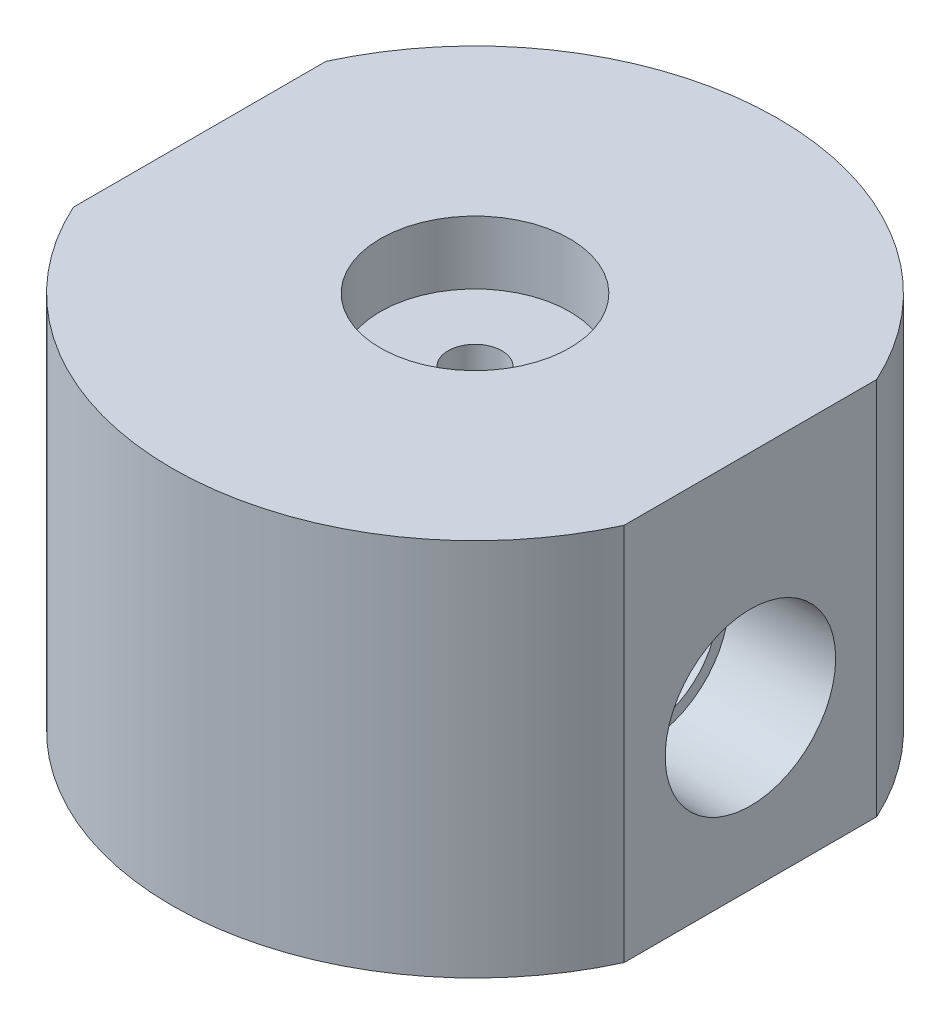
ISO-10303-21;
HEADER;
FILE_DESCRIPTION(('STEP AP214'),'2;1');
FILE_NAME('part.step','',(''),(''),'','','');
FILE_SCHEMA(('AUTOMOTIVE_DESIGN { 1 0 10303 214 1 1 1 1 }'));
ENDSEC;
DATA;
#1=APPLICATION_CONTEXT('core data for automotive mechanical design processes');
#2=APPLICATION_PROTOCOL_DEFINITION('international standard','automotive_design',2000,#1);
#3=PRODUCT_CONTEXT('',#1,'mechanical');
#4=PRODUCT('Part','Part','',(#3));
#5=PRODUCT_RELATED_PRODUCT_CATEGORY('part','',(#4));
#6=PRODUCT_DEFINITION_FORMATION('','',#4);
#7=PRODUCT_DEFINITION_CONTEXT('part definition',#1,'design');
#8=PRODUCT_DEFINITION('design','',#6,#7);
#9=PRODUCT_DEFINITION_SHAPE('','',#8);
#10=(LENGTH_UNIT() NAMED_UNIT(*) SI_UNIT(.MILLI.,.METRE.));
#11=(NAMED_UNIT(*) PLANE_ANGLE_UNIT() SI_UNIT($,.RADIAN.));
#12=(NAMED_UNIT(*) SI_UNIT($,.STERADIAN.) SOLID_ANGLE_UNIT());
#13=UNCERTAINTY_MEASURE_WITH_UNIT(LENGTH_MEASURE(1.E-05),#10,'distance_accuracy_value','');
#14=(GEOMETRIC_REPRESENTATION_CONTEXT(3) GLOBAL_UNCERTAINTY_ASSIGNED_CONTEXT((#13)) GLOBAL_UNIT_ASSIGNED_CONTEXT((#10,
#11,#12)) REPRESENTATION_CONTEXT('',''));
#15=CARTESIAN_POINT('',(0.,0.,0.));
#16=DIRECTION('',(0.,0.,1.));
#17=DIRECTION('',(1.,0.,0.));
#18=AXIS2_PLACEMENT_3D('',#15,#16,#17);
#19=CARTESIAN_POINT('',(0.,38.1,0.));
#20=DIRECTION('',(0.,1.,0.));
#21=DIRECTION('',(0.,0.,1.));
#22=AXIS2_PLACEMENT_3D('',#19,#20,#21);
#23=CYLINDRICAL_SURFACE('',#22,2.70509999999999);
#24=CARTESIAN_POINT('',(0.,20.6375,0.));
#25=DIRECTION('',(0.,1.,0.));
#26=DIRECTION('',(-1.,0.,0.));
#27=AXIS2_PLACEMENT_3D('',#24,#25,#26);
#28=CIRCLE('',#27,2.70509999999999);
#29=CARTESIAN_POINT('',(-2.70509999999999,20.6375,0.));
#30=VERTEX_POINT('',#29);
#31=EDGE_CURVE('E85',#30,#30,#28,.T.);
#32=ORIENTED_EDGE('',*,*,#31,.F.);
#33=EDGE_LOOP('',(#32));
#34=FACE_BOUND('',#33,.T.);
#35=CARTESIAN_POINT('',(0.,31.75,0.));
#36=DIRECTION('',(0.,1.,0.));
#37=DIRECTION('',(-1.,0.,0.));
#38=AXIS2_PLACEMENT_3D('',#35,#36,#37);
#39=CIRCLE('',#38,2.70509999999999);
#40=CARTESIAN_POINT('',(-2.70509999999999,31.75,0.));
#41=VERTEX_POINT('',#40);
#42=EDGE_CURVE('E40',#41,#41,#39,.F.);
#43=ORIENTED_EDGE('',*,*,#42,.F.);
#44=EDGE_LOOP('',(#43));
#45=FACE_BOUND('',#44,.T.);
#46=ADVANCED_FACE('F36',(#34,#45),#23,.F.);
#47=CARTESIAN_POINT('',(-30.48,0.,0.));
#48=DIRECTION('',(0.,1.,0.));
#49=DIRECTION('',(-1.,0.,0.));
#50=AXIS2_PLACEMENT_3D('',#47,#48,#49);
#51=PLANE('',#50);
#52=CARTESIAN_POINT('',(0.,0.,0.));
#53=DIRECTION('',(0.,-1.,0.));
#54=DIRECTION('',(1.,0.,0.));
#55=AXIS2_PLACEMENT_3D('',#52,#53,#54);
#56=CIRCLE('',#55,12.7);
#57=CARTESIAN_POINT('',(12.7,0.,0.));
#58=VERTEX_POINT('',#57);
#59=EDGE_CURVE('E99',#58,#58,#56,.T.);
#60=ORIENTED_EDGE('',*,*,#59,.F.);
#61=EDGE_LOOP('',(#60));
#62=FACE_BOUND('',#61,.T.);
#63=DIRECTION('',(0.,0.,-1.));
#64=VECTOR('',#63,1.);
#65=CARTESIAN_POINT('',(-27.7081287711747,0.,-12.7));
#66=LINE('',#65,#64);
#67=CARTESIAN_POINT('',(-27.7081287711747,0.,12.7));
#68=VERTEX_POINT('',#67);
#69=CARTESIAN_POINT('',(-27.7081287711747,0.,-12.7));
#70=VERTEX_POINT('',#69);
#71=EDGE_CURVE('E79',#68,#70,#66,.T.);
#72=ORIENTED_EDGE('',*,*,#71,.T.);
#73=CARTESIAN_POINT('',(0.,0.,0.));
#74=DIRECTION('',(0.,-1.,0.));
#75=DIRECTION('',(1.,0.,0.));
#76=AXIS2_PLACEMENT_3D('',#73,#74,#75);
#77=CIRCLE('',#76,30.48);
#78=CARTESIAN_POINT('',(27.7081287711747,0.,-12.7));
#79=VERTEX_POINT('',#78);
#80=EDGE_CURVE('E92',#70,#79,#77,.T.);
#81=ORIENTED_EDGE('',*,*,#80,.T.);
#82=DIRECTION('',(0.,0.,1.));
#83=VECTOR('',#82,1.);
#84=CARTESIAN_POINT('',(27.7081287711747,0.,-12.7));
#85=LINE('',#84,#83);
#86=CARTESIAN_POINT('',(27.7081287711747,0.,12.7));
#87=VERTEX_POINT('',#86);
#88=EDGE_CURVE('E121',#79,#87,#85,.T.);
#89=ORIENTED_EDGE('',*,*,#88,.T.);
#90=EDGE_CURVE('E94',#87,#68,#77,.T.);
#91=ORIENTED_EDGE('',*,*,#90,.T.);
#92=EDGE_LOOP('',(#72,#81,#89,#91));
#93=FACE_BOUND('',#92,.T.);
#94=ADVANCED_FACE('F90',(#62,#93),#51,.F.);
#95=CARTESIAN_POINT('',(0.,0.,0.));
#96=DIRECTION('',(0.,-1.,0.));
#97=DIRECTION('',(1.,0.,0.));
#98=AXIS2_PLACEMENT_3D('',#95,#96,#97);
#99=CYLINDRICAL_SURFACE('',#98,30.48);
#100=DIRECTION('',(0.,-1.,0.));
#101=VECTOR('',#100,1.);
#102=CARTESIAN_POINT('',(-27.7081287711747,38.1,-12.7));
#103=LINE('',#102,#101);
#104=CARTESIAN_POINT('',(-27.7081287711747,38.1,-12.7));
#105=VERTEX_POINT('',#104);
#106=EDGE_CURVE('E76',#105,#70,#103,.T.);
#107=ORIENTED_EDGE('',*,*,#106,.F.);
#108=CARTESIAN_POINT('',(0.,38.1,0.));
#109=DIRECTION('',(0.,-1.,0.));
#110=DIRECTION('',(1.,0.,0.));
#111=AXIS2_PLACEMENT_3D('',#108,#109,#110);
#112=CIRCLE('',#111,30.48);
#113=CARTESIAN_POINT('',(27.7081287711747,38.1,-12.7));
#114=VERTEX_POINT('',#113);
#115=EDGE_CURVE('E101',#105,#114,#112,.T.);
#116=ORIENTED_EDGE('',*,*,#115,.T.);
#117=DIRECTION('',(0.,-1.,0.));
#118=VECTOR('',#117,1.);
#119=CARTESIAN_POINT('',(27.7081287711747,38.1,-12.7));
#120=LINE('',#119,#118);
#121=EDGE_CURVE('E52',#114,#79,#120,.T.);
#122=ORIENTED_EDGE('',*,*,#121,.T.);
#123=ORIENTED_EDGE('',*,*,#80,.F.);
#124=EDGE_LOOP('',(#107,#116,#122,#123));
#125=FACE_BOUND('',#124,.T.);
#126=ADVANCED_FACE('F96',(#125),#99,.T.);
#127=DIRECTION('',(0.,-1.,0.));
#128=VECTOR('',#127,1.);
#129=CARTESIAN_POINT('',(-27.7081287711747,38.1,12.7));
#130=LINE('',#129,#128);
#131=CARTESIAN_POINT('',(-27.7081287711747,38.1,12.7));
#132=VERTEX_POINT('',#131);
#133=EDGE_CURVE('E60',#132,#68,#130,.T.);
#134=ORIENTED_EDGE('',*,*,#133,.T.);
#135=ORIENTED_EDGE('',*,*,#90,.F.);
#136=DIRECTION('',(0.,-1.,0.));
#137=VECTOR('',#136,1.);
#138=CARTESIAN_POINT('',(27.7081287711747,38.1,12.7));
#139=LINE('',#138,#137);
#140=CARTESIAN_POINT('',(27.7081287711747,38.1,12.7));
#141=VERTEX_POINT('',#140);
#142=EDGE_CURVE('E203',#141,#87,#139,.T.);
#143=ORIENTED_EDGE('',*,*,#142,.F.);
#144=EDGE_CURVE('E97',#141,#132,#112,.T.);
#145=ORIENTED_EDGE('',*,*,#144,.T.);
#146=EDGE_LOOP('',(#134,#135,#143,#145));
#147=FACE_BOUND('',#146,.T.);
#148=ADVANCED_FACE('F155',(#147),#99,.T.);
#149=CARTESIAN_POINT('',(0.,38.1,0.));
#150=DIRECTION('',(0.,-1.,0.));
#151=DIRECTION('',(1.,0.,0.));
#152=AXIS2_PLACEMENT_3D('',#149,#150,#151);
#153=PLANE('',#152);
#154=CARTESIAN_POINT('',(0.,38.1,0.));
#155=DIRECTION('',(0.,1.,0.));
#156=DIRECTION('',(-1.,0.,0.));
#157=AXIS2_PLACEMENT_3D('',#154,#155,#156);
#158=CIRCLE('',#157,9.525);
#159=CARTESIAN_POINT('',(-9.525,38.1,0.));
#160=VERTEX_POINT('',#159);
#161=EDGE_CURVE('E378',#160,#160,#158,.T.);
#162=ORIENTED_EDGE('',*,*,#161,.F.);
#163=EDGE_LOOP('',(#162));
#164=FACE_BOUND('',#163,.T.);
#165=DIRECTION('',(0.,0.,-1.));
#166=VECTOR('',#165,1.);
#167=CARTESIAN_POINT('',(-27.7081287711747,38.1,-12.7));
#168=LINE('',#167,#166);
#169=EDGE_CURVE('E80',#132,#105,#168,.T.);
#170=ORIENTED_EDGE('',*,*,#169,.F.);
#171=ORIENTED_EDGE('',*,*,#144,.F.);
#172=DIRECTION('',(0.,0.,1.));
#173=VECTOR('',#172,1.);
#174=CARTESIAN_POINT('',(27.7081287711747,38.1,-12.7));
#175=LINE('',#174,#173);
#176=EDGE_CURVE('E201',#114,#141,#175,.T.);
#177=ORIENTED_EDGE('',*,*,#176,.F.);
#178=ORIENTED_EDGE('',*,*,#115,.F.);
#179=EDGE_LOOP('',(#170,#171,#177,#178));
#180=FACE_BOUND('',#179,.T.);
#181=ADVANCED_FACE('F151',(#164,#180),#153,.F.);
#182=CARTESIAN_POINT('',(-4.7625,20.6375,0.));
#183=DIRECTION('',(0.,1.,0.));
#184=DIRECTION('',(-1.,0.,0.));
#185=AXIS2_PLACEMENT_3D('',#182,#183,#184);
#186=PLANE('',#185);
#187=ORIENTED_EDGE('',*,*,#31,.T.);
#188=EDGE_LOOP('',(#187));
#189=FACE_BOUND('',#188,.T.);
#190=CARTESIAN_POINT('',(0.,20.6375,0.));
#191=DIRECTION('',(0.,-1.,0.));
#192=DIRECTION('',(1.,0.,0.));
#193=AXIS2_PLACEMENT_3D('',#190,#191,#192);
#194=CIRCLE('',#193,4.7625);
#195=CARTESIAN_POINT('',(4.7625,20.6375,0.));
#196=VERTEX_POINT('',#195);
#197=EDGE_CURVE('E110',#196,#196,#194,.T.);
#198=ORIENTED_EDGE('',*,*,#197,.T.);
#199=EDGE_LOOP('',(#198));
#200=FACE_BOUND('',#199,.T.);
#201=ADVANCED_FACE('F154',(#189,#200),#186,.F.);
#202=CARTESIAN_POINT('',(0.,20.6375,0.));
#203=DIRECTION('',(0.,-1.,0.));
#204=DIRECTION('',(1.,0.,0.));
#205=AXIS2_PLACEMENT_3D('',#202,#203,#204);
#206=TOROIDAL_SURFACE('',#205,9.525,4.7625);
#207=ORIENTED_EDGE('',*,*,#197,.F.);
#208=EDGE_LOOP('',(#207));
#209=FACE_BOUND('',#208,.T.);
#210=CARTESIAN_POINT('',(0.,25.4,0.));
#211=DIRECTION('',(0.,-1.,0.));
#212=DIRECTION('',(1.,0.,0.));
#213=AXIS2_PLACEMENT_3D('',#210,#211,#212);
#214=CIRCLE('',#213,9.525);
#215=CARTESIAN_POINT('',(9.525,25.4,0.));
#216=VERTEX_POINT('',#215);
#217=EDGE_CURVE('E107',#216,#216,#214,.T.);
#218=ORIENTED_EDGE('',*,*,#217,.T.);
#219=EDGE_LOOP('',(#218));
#220=FACE_BOUND('',#219,.T.);
#221=ADVANCED_FACE('F170',(#209,#220),#206,.F.);
#222=CARTESIAN_POINT('',(-12.7,25.4,0.));
#223=DIRECTION('',(0.,1.,0.));
#224=DIRECTION('',(-1.,0.,0.));
#225=AXIS2_PLACEMENT_3D('',#222,#223,#224);
#226=PLANE('',#225);
#227=CARTESIAN_POINT('',(0.,25.4,0.));
#228=DIRECTION('',(0.,1.,0.));
#229=DIRECTION('',(-1.,0.,0.));
#230=AXIS2_PLACEMENT_3D('',#227,#228,#229);
#231=CIRCLE('',#230,11.1125);
#232=CARTESIAN_POINT('',(-11.1125,25.4,0.));
#233=VERTEX_POINT('',#232);
#234=EDGE_CURVE('E45',#233,#233,#231,.F.);
#235=ORIENTED_EDGE('',*,*,#234,.T.);
#236=EDGE_LOOP('',(#235));
#237=FACE_BOUND('',#236,.T.);
#238=ORIENTED_EDGE('',*,*,#217,.F.);
#239=EDGE_LOOP('',(#238));
#240=FACE_BOUND('',#239,.T.);
#241=ADVANCED_FACE('F165',(#237,#240),#226,.F.);
#242=CARTESIAN_POINT('',(0.,0.,0.));
#243=DIRECTION('',(0.,-1.,0.));
#244=DIRECTION('',(1.,0.,0.));
#245=AXIS2_PLACEMENT_3D('',#242,#243,#244);
#246=CYLINDRICAL_SURFACE('',#245,12.7);
#247=CARTESIAN_POINT('',(0.,23.8125,0.));
#248=DIRECTION('',(0.,1.,0.));
#249=DIRECTION('',(-1.,0.,0.));
#250=AXIS2_PLACEMENT_3D('',#247,#248,#249);
#251=CIRCLE('',#250,12.7);
#252=CARTESIAN_POINT('',(-12.7,23.8125,0.));
#253=VERTEX_POINT('',#252);
#254=EDGE_CURVE('E11',#253,#253,#251,.T.);
#255=ORIENTED_EDGE('',*,*,#254,.T.);
#256=EDGE_LOOP('',(#255));
#257=FACE_BOUND('',#256,.T.);
#258=CARTESIAN_POINT('',(-10.5046428420961,15.875,7.1374));
#259=CARTESIAN_POINT('',(-10.5046384380999,16.0571885207218,7.13740318034243));
#260=CARTESIAN_POINT('',(-10.5093972937738,16.239345236265,7.13041663459684));
#261=CARTESIAN_POINT('',(-10.5282237924394,16.6021747896126,7.1025907449902));
#262=CARTESIAN_POINT('',(-10.5422941351203,16.7828471816806,7.08174738360001));
#263=CARTESIAN_POINT('',(-10.5791968979329,17.1413879903336,7.02649901775071));
#264=CARTESIAN_POINT('',(-10.6020390798196,17.3192530523683,6.992078903218));
#265=CARTESIAN_POINT('',(-10.655618633279,17.6707973307695,6.91015072245628));
#266=CARTESIAN_POINT('',(-10.6863595676358,17.8444746194437,6.86263674945325));
#267=CARTESIAN_POINT('',(-10.7544138063225,18.1853243381491,6.75548490621666));
#268=CARTESIAN_POINT('',(-10.7916796970738,18.3525337341939,6.69593405006417));
#269=CARTESIAN_POINT('',(-10.8717790317736,18.6809650254671,6.56508234790449));
#270=CARTESIAN_POINT('',(-10.9146145325229,18.8421846803247,6.4937771585225));
#271=CARTESIAN_POINT('',(-11.0046465840686,19.157929153595,6.34000607577323));
#272=CARTESIAN_POINT('',(-11.0518427907881,19.3124544988045,6.25754106272219));
#273=CARTESIAN_POINT('',(-11.1494005157995,19.6142522248498,6.08202115176529));
#274=CARTESIAN_POINT('',(-11.1997621424831,19.7615243570098,5.98896589113528));
#275=CARTESIAN_POINT('',(-11.3647828713443,20.2222467242849,5.67375486549948));
#276=CARTESIAN_POINT('',(-11.4834901888025,20.5210942736974,5.43165852463271));
#277=CARTESIAN_POINT('',(-11.6601585300767,20.9373659806184,5.03505781718803));
#278=CARTESIAN_POINT('',(-11.7188534882378,21.0708661307312,4.89718124346336));
#279=CARTESIAN_POINT('',(-11.8345184709773,21.3267272916708,4.61064023873438));
#280=CARTESIAN_POINT('',(-11.8914881996462,21.4490863987388,4.46197397177976));
#281=CARTESIAN_POINT('',(-12.0074276448785,21.6924974144983,4.14047014968672));
#282=CARTESIAN_POINT('',(-12.0661057013464,21.8124117821013,3.96666477196833));
#283=CARTESIAN_POINT('',(-12.1781790237355,22.0369789824457,3.60794136867089));
#284=CARTESIAN_POINT('',(-12.2315766055884,22.1416385153443,3.42302827247314));
#285=CARTESIAN_POINT('',(-12.3315692759593,22.3346355130106,3.04318115996294));
#286=CARTESIAN_POINT('',(-12.3781667356681,22.4229786701377,2.84825066891206));
#287=CARTESIAN_POINT('',(-12.4631664513921,22.5822749882884,2.44968907177722));
#288=CARTESIAN_POINT('',(-12.5015698557444,22.6532305862587,2.24605918965644));
#289=CARTESIAN_POINT('',(-12.566054794428,22.7714080311198,1.84961155335952));
#290=CARTESIAN_POINT('',(-12.5929124085411,22.8201470613767,1.65737182841722));
#291=CARTESIAN_POINT('',(-12.6380040169668,22.9015764797823,1.26852227946975));
#292=CARTESIAN_POINT('',(-12.6562384639096,22.9342677102836,1.07191268540637));
#293=CARTESIAN_POINT('',(-12.6835382069931,22.9830960790112,0.676148620600247));
#294=CARTESIAN_POINT('',(-12.6926096410685,22.9992442988397,0.47699594403947));
#295=CARTESIAN_POINT('',(-12.7013297715325,23.0147689488544,0.0778383656640306));
#296=CARTESIAN_POINT('',(-12.7009792608145,23.0141467903334,-0.122166463022408));
#297=CARTESIAN_POINT('',(-12.6914261859183,22.9971354781539,-0.499298139911756));
#298=CARTESIAN_POINT('',(-12.6831974604438,22.9824808690008,-0.67653123111751));
#299=CARTESIAN_POINT('',(-12.6594778364211,22.940066758124,-1.02899179656521));
#300=CARTESIAN_POINT('',(-12.6439845353348,22.9123029208995,-1.20421858762946));
#301=CARTESIAN_POINT('',(-12.6061030371758,22.844011278604,-1.55133536569325));
#302=CARTESIAN_POINT('',(-12.5837172507358,22.803487936032,-1.72322649702429));
#303=CARTESIAN_POINT('',(-12.532545745632,22.7101083215367,-2.06271237029165));
#304=CARTESIAN_POINT('',(-12.5037575293403,22.6572472361837,-2.23030540697949));
#305=CARTESIAN_POINT('',(-12.4401106775075,22.5391826403443,-2.56171308094082));
#306=CARTESIAN_POINT('',(-12.4051980211314,22.4738688026832,-2.72547801440405));
#307=CARTESIAN_POINT('',(-12.3302228224087,22.3318180554349,-3.04677940544123));
#308=CARTESIAN_POINT('',(-12.290158554304,22.2550773165393,-3.20431375257775));
#309=CARTESIAN_POINT('',(-12.1634430119379,22.0086596040008,-3.66639570123493));
#310=CARTESIAN_POINT('',(-12.0702275186606,21.8227122647099,-3.96063011120466));
#311=CARTESIAN_POINT('',(-11.8623879915353,21.3894169315703,-4.5476597164089));
#312=CARTESIAN_POINT('',(-11.7465362459822,21.137548056501,-4.83668159530947));
#313=CARTESIAN_POINT('',(-11.5709229239903,20.7282351982539,-5.23689917474902));
#314=CARTESIAN_POINT('',(-11.5120270642702,20.5864085953654,-5.3648494441244));
#315=CARTESIAN_POINT('',(-11.3949792904751,20.2927126755584,-5.60916804512605));
#316=CARTESIAN_POINT('',(-11.3368275126708,20.1408415496421,-5.72553428098645));
#317=CARTESIAN_POINT('',(-11.217344140053,19.8128627176192,-5.95648099288631));
#318=CARTESIAN_POINT('',(-11.1562320192129,19.6358212782517,-6.06985153604781));
#319=CARTESIAN_POINT('',(-11.0386951868657,19.2713226169917,-6.28106771389895));
#320=CARTESIAN_POINT('',(-10.982268388456,19.0838700950964,-6.3789202783591));
#321=CARTESIAN_POINT('',(-10.8761885637896,18.6995414941414,-6.55815279325877));
#322=CARTESIAN_POINT('',(-10.8265311583643,18.5026716196748,-6.63954340969375));
#323=CARTESIAN_POINT('',(-10.7360436879727,18.1006312817048,-6.78488827268485));
#324=CARTESIAN_POINT('',(-10.6952121648466,17.8954621960071,-6.84884539995476));
#325=CARTESIAN_POINT('',(-10.6271543479783,17.4950732288003,-6.9539337623092));
#326=CARTESIAN_POINT('',(-10.5991024742221,17.3003656025546,-6.99647904311352));
#327=CARTESIAN_POINT('',(-10.5533939050683,16.9068723001115,-7.06523838157507));
#328=CARTESIAN_POINT('',(-10.5357365202536,16.7080868952788,-7.09145352233967));
#329=CARTESIAN_POINT('',(-10.5116969767819,16.3085511391283,-7.12703947721939));
#330=CARTESIAN_POINT('',(-10.5053023850648,16.1078032008343,-7.13642886557634));
#331=CARTESIAN_POINT('',(-10.504080815511,15.7062081788998,-7.13822761317463));
#332=CARTESIAN_POINT('',(-10.5092524244061,15.5053611103699,-7.13063904694356));
#333=CARTESIAN_POINT('',(-10.5292025973892,15.1367353282911,-7.10113623496951));
#334=CARTESIAN_POINT('',(-10.5423633208309,14.9686681583747,-7.08163150165601));
#335=CARTESIAN_POINT('',(-10.5762697322621,14.6350380459145,-7.03089265189279));
#336=CARTESIAN_POINT('',(-10.5970178275353,14.4694759155375,-6.9996548127363));
#337=CARTESIAN_POINT('',(-10.6454120260299,14.1419350585254,-6.92583167669698));
#338=CARTESIAN_POINT('',(-10.67305816281,13.9799563493277,-6.88324632460905));
#339=CARTESIAN_POINT('',(-10.7343980452998,13.6604090719483,-6.78718961209065));
#340=CARTESIAN_POINT('',(-10.7680942279554,13.5028423105628,-6.73371386386184));
#341=CARTESIAN_POINT('',(-10.8797370818527,13.0255904599105,-6.55300688465579));
#342=CARTESIAN_POINT('',(-10.9662239048777,12.714273140701,-6.40841652282442));
#343=CARTESIAN_POINT('',(-11.1524578723252,12.1186466284339,-6.0785333233211));
#344=CARTESIAN_POINT('',(-11.2522113613607,11.834350470145,-5.89322098305081));
#345=CARTESIAN_POINT('',(-11.473749178587,11.2507248023908,-5.45103287254007));
#346=CARTESIAN_POINT('',(-11.596432432055,10.9568007009694,-5.18737573443568));
#347=CARTESIAN_POINT('',(-11.7762289412971,10.5508355730185,-4.75759622007421));
#348=CARTESIAN_POINT('',(-11.8354964281967,10.4212555017456,-4.60850422276793));
#349=CARTESIAN_POINT('',(-11.9512654543222,10.1743751347253,-4.29935517960494));
#350=CARTESIAN_POINT('',(-12.0077665991347,10.0570765873269,-4.13929657793692));
#351=CARTESIAN_POINT('',(-12.1197637097564,9.82921128717774,-3.79936729090075));
#352=CARTESIAN_POINT('',(-12.1750104899115,9.71943176432677,-3.61888580945294));
#353=CARTESIAN_POINT('',(-12.2792674142712,9.51571214959983,-3.24757559409014));
#354=CARTESIAN_POINT('',(-12.3282805270439,9.42176451135708,-3.05675184753378));
#355=CARTESIAN_POINT('',(-12.4186304398947,9.25079241296938,-2.66604447022575));
#356=CARTESIAN_POINT('',(-12.4599718075299,9.17375787816755,-2.4661663190005));
#357=CARTESIAN_POINT('',(-12.5337203696762,9.03760985387302,-2.05880344435932));
#358=CARTESIAN_POINT('',(-12.5661289554756,8.97849357345384,-1.85131991119801));
#359=CARTESIAN_POINT('',(-12.6181070094158,8.88425773937235,-1.45242631442551));
#360=CARTESIAN_POINT('',(-12.6386593520448,8.84728550109669,-1.26158051285968));
#361=CARTESIAN_POINT('',(-12.671168294888,8.78898747316854,-0.87678907272025));
#362=CARTESIAN_POINT('',(-12.6831254919188,8.76766059715522,-0.682843650329503));
#363=CARTESIAN_POINT('',(-12.6980987215568,8.74097508595594,-0.293607804317499));
#364=CARTESIAN_POINT('',(-12.7011190861783,8.73560871411491,-0.0983180783614488));
#365=CARTESIAN_POINT('',(-12.6981426965452,8.74090488111599,0.291969552927191));
#366=CARTESIAN_POINT('',(-12.6921464549616,8.75156650862952,0.486967474220344));
#367=CARTESIAN_POINT('',(-12.6723138857647,8.78696745278776,0.856347246712767));
#368=CARTESIAN_POINT('',(-12.6592840488983,8.81025959826667,1.0309137900436));
#369=CARTESIAN_POINT('',(-12.6262976171224,8.86953943552658,1.37727221037094));
#370=CARTESIAN_POINT('',(-12.6063387156596,8.90553135488558,1.54906314346605));
#371=CARTESIAN_POINT('',(-12.5599513108449,8.98979186297556,1.88864631307378));
#372=CARTESIAN_POINT('',(-12.533524877322,9.0380565242066,2.05643981008563));
#373=CARTESIAN_POINT('',(-12.4747606360812,9.14638932718757,2.38716859865103));
#374=CARTESIAN_POINT('',(-12.4424205568677,9.20646200519191,2.55010199531915));
#375=CARTESIAN_POINT('',(-12.3714225292325,9.3398746077906,2.87513681209172));
#376=CARTESIAN_POINT('',(-12.3326007476926,9.41356600337798,3.03705823848522));
#377=CARTESIAN_POINT('',(-12.2501998668405,9.57226535603055,3.35402257615991));
#378=CARTESIAN_POINT('',(-12.2066190443768,9.65727741453751,3.50906296719122));
#379=CARTESIAN_POINT('',(-12.070033844169,9.92834954652732,3.96280615334452));
#380=CARTESIAN_POINT('',(-11.9711454374441,10.1305210494496,4.25031311497974));
#381=CARTESIAN_POINT('',(-11.7531173393558,10.5989928355987,4.8227546257585));
#382=CARTESIAN_POINT('',(-11.6329648602901,10.8700449685917,5.10338371404615));
#383=CARTESIAN_POINT('',(-11.3935611796939,11.4549448815599,5.61758165658461));
#384=CARTESIAN_POINT('',(-11.274311336963,11.7688472849584,5.85108948585872));
#385=CARTESIAN_POINT('',(-11.101447276054,12.2801523521683,6.16960571611111));
#386=CARTESIAN_POINT('',(-11.0429454178772,12.464444120094,6.27340588463441));
#387=CARTESIAN_POINT('',(-10.9319427961333,12.8430697875085,6.46489415808161));
#388=CARTESIAN_POINT('',(-10.8794430881835,13.037405444748,6.5525794304695));
#389=CARTESIAN_POINT('',(-10.7827229910832,13.434398399155,6.71054843225052));
#390=CARTESIAN_POINT('',(-10.7384808535945,13.6370320724601,6.78087803427556));
#391=CARTESIAN_POINT('',(-10.6601564542954,14.049521892484,6.90335820288767));
#392=CARTESIAN_POINT('',(-10.6260679249286,14.2593734941451,6.95551998737431));
#393=CARTESIAN_POINT('',(-10.5675446018097,14.7014688522908,7.04415177515685));
#394=CARTESIAN_POINT('',(-10.5440948197023,14.9341649441559,7.07904127815151));
#395=CARTESIAN_POINT('',(-10.5126475384401,15.4029253665551,7.12566221249141));
#396=CARTESIAN_POINT('',(-10.5046485471202,15.6389893696137,7.1373958801212));
#397=CARTESIAN_POINT('',(-10.5046428420961,15.875,7.1374));
#398=B_SPLINE_CURVE_WITH_KNOTS('',3,(#258,#259,#260,#261,#262,#263,#264,#265,#266,#267,#268,
#269,#270,#271,#272,#273,#274,#275,#276,#277,#278,#279,#280,#281,#282,#283,#284,#285,#286,#287,
#288,#289,#290,#291,#292,#293,#294,#295,#296,#297,#298,#299,#300,#301,#302,#303,#304,#305,#306,
#307,#308,#309,#310,#311,#312,#313,#314,#315,#316,#317,#318,#319,#320,#321,#322,#323,#324,#325,
#326,#327,#328,#329,#330,#331,#332,#333,#334,#335,#336,#337,#338,#339,#340,#341,#342,#343,#344,
#345,#346,#347,#348,#349,#350,#351,#352,#353,#354,#355,#356,#357,#358,#359,#360,#361,#362,#363,
#364,#365,#366,#367,#368,#369,#370,#371,#372,#373,#374,#375,#376,#377,#378,#379,#380,#381,#382,
#383,#384,#385,#386,#387,#388,#389,#390,#391,#392,#393,#394,#395,#396,#397),.UNSPECIFIED.,.T.,
.F.,(4,2,2,2,2,2,2,2,2,2,2,2,2,2,2,2,2,2,2,2,2,2,2,2,2,2,2,2,2,2,2,2,2,2,2,2,2,2,2,2,2,2,2,2,2,
2,2,2,2,2,2,2,2,2,2,2,2,2,2,2,2,2,2,2,2,2,2,2,2,4),(0.,0.546317247372504,1.09279295851296,
1.63987858666222,2.1872114158945,2.73072067840406,3.27443122650422,3.81809891025927,
4.36178522065879,5.56349502165735,6.16513087505346,6.7668693425818,7.42350189454884,
8.07984516871215,8.7359590274405,9.39198087611972,9.99153541233056,10.5910584744248,
11.1901796732152,11.7892504537753,12.3227004309783,12.8563269551551,13.3897670561357,
13.9234156215942,14.4620325016777,15.0008302874473,16.0777585380745,17.2740369612609,
17.8732215593314,18.472514364711,19.1284906994748,19.7841732688923,20.4394296390615,
21.0945776687883,21.6974541752749,22.3002906913183,22.9024613146922,23.5045583631644,
24.0130879304142,24.5217789815737,25.0304725075358,25.5393713957497,26.5969363896851,
27.6550089815381,28.8896107002363,29.5077785231636,30.1260342267007,30.7802153984212,
31.4340838631583,32.0875617738157,32.7409378471455,33.326562039351,33.9121455639512,
34.4974451879503,35.0827115339273,35.6118846778583,36.1412341426105,36.6704144186638,
37.1997983872274,37.7454778179608,38.291355487311,39.3825127243748,40.60240589502,
41.8238689055535,42.4814865525387,43.1392196795001,43.7951952757489,44.4507651122884,
45.15854368889,45.8662539081315),.UNSPECIFIED.);
#399=CARTESIAN_POINT('',(-10.5046428420961,15.875,7.1374));
#400=VERTEX_POINT('',#399);
#401=EDGE_CURVE('E123',#400,#400,#398,.T.);
#402=ORIENTED_EDGE('',*,*,#401,.T.);
#403=EDGE_LOOP('',(#402));
#404=FACE_BOUND('',#403,.T.);
#405=CARTESIAN_POINT('',(12.7,23.0124,0.));
#406=CARTESIAN_POINT('',(12.700000876807,23.0124009936644,0.184904929574663));
#407=CARTESIAN_POINT('',(12.6959535476283,23.0052071911584,0.369797500413099));
#408=CARTESIAN_POINT('',(12.6798718257238,22.9765329841949,0.738122452168562));
#409=CARTESIAN_POINT('',(12.6678374950963,22.9550526908135,0.92155484442712));
#410=CARTESIAN_POINT('',(12.6360885055464,22.8980883096279,1.28555389016583));
#411=CARTESIAN_POINT('',(12.6163736438416,22.8626038520834,1.46612046785132));
#412=CARTESIAN_POINT('',(12.5697544161722,22.7780750980333,1.82309727276552));
#413=CARTESIAN_POINT('',(12.5428498220439,22.7290303711953,1.99950736789626));
#414=CARTESIAN_POINT('',(12.4826095396005,22.6181579894361,2.34633941837148));
#415=CARTESIAN_POINT('',(12.4492997565313,22.5563817561362,2.51678233155365));
#416=CARTESIAN_POINT('',(12.3769342999755,22.4205533558444,2.85146716033432));
#417=CARTESIAN_POINT('',(12.3378765962518,22.3464968501309,3.01570685901592));
#418=CARTESIAN_POINT('',(12.2133398370307,22.106924632696,3.49774238755791));
#419=CARTESIAN_POINT('',(12.1204497584333,21.9239215462696,3.80511623355527));
#420=CARTESIAN_POINT('',(11.915369381618,21.5021512630649,4.407062773049));
#421=CARTESIAN_POINT('',(11.8022797973093,21.2603607815412,4.69920247423624));
#422=CARTESIAN_POINT('',(11.6295623323307,20.8663028078596,5.10539571628878));
#423=CARTESIAN_POINT('',(11.5714260412505,20.7295938426133,5.23555290968093));
#424=CARTESIAN_POINT('',(11.4554129183697,20.4461807948073,5.4847403474616));
#425=CARTESIAN_POINT('',(11.3975361335166,20.2994749757634,5.60376865016615));
#426=CARTESIAN_POINT('',(11.2774749969757,19.9808391710674,5.84193130463105));
#427=CARTESIAN_POINT('',(11.2154725930866,19.8078753658197,5.95977673023518));
#428=CARTESIAN_POINT('',(11.0954488406606,19.4512610867616,6.18035443784559));
#429=CARTESIAN_POINT('',(11.0374271399769,19.2676115609106,6.28308805761737));
#430=CARTESIAN_POINT('',(10.9274635571065,18.8906907439447,6.47244316086091));
#431=CARTESIAN_POINT('',(10.8755151591973,18.6974300874781,6.55908197149864));
#432=CARTESIAN_POINT('',(10.779717622894,18.3022386554957,6.71536314494143));
#433=CARTESIAN_POINT('',(10.7358659446637,18.1003106234034,6.78501083984947));
#434=CARTESIAN_POINT('',(10.6665830292518,17.7333892869457,6.89327193257613));
#435=CARTESIAN_POINT('',(10.6392183007702,17.5697725410544,6.93533787014629));
#436=CARTESIAN_POINT('',(10.5915644192817,17.238993540403,7.0078993832584));
#437=CARTESIAN_POINT('',(10.5712738115532,17.0718320220987,7.03839733775309));
#438=CARTESIAN_POINT('',(10.538468980293,16.7351453245418,7.08742155025434));
#439=CARTESIAN_POINT('',(10.5259482473972,16.5656222458167,7.10595782990795));
#440=CARTESIAN_POINT('',(10.5091067636431,16.2252688859143,7.13084169427597));
#441=CARTESIAN_POINT('',(10.5047861815353,16.0544385779084,7.13718902815471));
#442=CARTESIAN_POINT('',(10.5045063726078,15.7125527984802,7.1376008608317));
#443=CARTESIAN_POINT('',(10.508557104473,15.5414973010816,7.13165073031637));
#444=CARTESIAN_POINT('',(10.524888861393,15.2006514045302,7.10752588943345));
#445=CARTESIAN_POINT('',(10.5371699160136,15.0308610099242,7.08935113515111));
#446=CARTESIAN_POINT('',(10.5695239358537,14.6936907914373,7.04102305099934));
#447=CARTESIAN_POINT('',(10.589599801894,14.5263118890658,7.01086526157347));
#448=CARTESIAN_POINT('',(10.6368656265508,14.1950333556598,6.93894353362277));
#449=CARTESIAN_POINT('',(10.6640584506921,14.0311351548749,6.89717491977089));
#450=CARTESIAN_POINT('',(10.7246411043775,13.7080814092937,6.80258899682234));
#451=CARTESIAN_POINT('',(10.7580193568099,13.5489176386644,6.74979230560468));
#452=CARTESIAN_POINT('',(10.8300548448377,13.2357160316708,6.63359486895822));
#453=CARTESIAN_POINT('',(10.8687138168998,13.0816799022447,6.57019063388735));
#454=CARTESIAN_POINT('',(10.9911039493422,12.6282326802616,6.3648288204329));
#455=CARTESIAN_POINT('',(11.0812798916393,12.3373234487519,6.20767490176192));
#456=CARTESIAN_POINT('',(11.2855700363742,11.7388510519534,5.8291408996606));
#457=CARTESIAN_POINT('',(11.4012268285716,11.4357204299176,5.60157617576747));
#458=CARTESIAN_POINT('',(11.5753573221366,11.0110501598062,5.2268725518368));
#459=CARTESIAN_POINT('',(11.6335510961686,10.8744089078109,5.09630437607933));
#460=CARTESIAN_POINT('',(11.748893506944,10.6116429891952,4.82444581601324));
#461=CARTESIAN_POINT('',(11.8060419687958,10.4855200700619,4.68315365746976));
#462=CARTESIAN_POINT('',(11.9239767345557,10.2316274946444,4.37479823427273));
#463=CARTESIAN_POINT('',(11.9845003222762,10.1051187503869,4.20659391377834));
#464=CARTESIAN_POINT('',(12.1010103932768,9.86686182906821,3.85865087996656));
#465=CARTESIAN_POINT('',(12.1569987322939,9.75510760282882,3.67891693884774));
#466=CARTESIAN_POINT('',(12.2628837437345,9.54737958561198,3.30888241870283));
#467=CARTESIAN_POINT('',(12.3127818404377,9.45140210321657,3.1185843254401));
#468=CARTESIAN_POINT('',(12.4050279356188,9.27630796127532,2.72862696538006));
#469=CARTESIAN_POINT('',(12.4473768611372,9.19718923123592,2.52896885180458));
#470=CARTESIAN_POINT('',(12.5205457084827,9.06181043003994,2.13611992502785));
#471=CARTESIAN_POINT('',(12.5519665038767,9.00433508731668,1.9434599376875));
#472=CARTESIAN_POINT('',(12.6062524148078,8.90565428406892,1.55282678405985));
#473=CARTESIAN_POINT('',(12.6291178569305,8.86444820249101,1.35485382089522));
#474=CARTESIAN_POINT('',(12.6655958211484,8.79894627899916,0.955440543740137));
#475=CARTESIAN_POINT('',(12.6792154653702,8.77463742064627,0.754003021463326));
#476=CARTESIAN_POINT('',(12.6968077015918,8.74326973222018,0.349377344987419));
#477=CARTESIAN_POINT('',(12.7007812938497,8.73620911357107,0.146189374496027));
#478=CARTESIAN_POINT('',(12.6990699269894,8.73925554284907,-0.236266558711001));
#479=CARTESIAN_POINT('',(12.6944582355947,8.7474548718129,-0.41555817054007));
#480=CARTESIAN_POINT('',(12.6777335702278,8.77728477656812,-0.772668646524538));
#481=CARTESIAN_POINT('',(12.6656206855514,8.79891519247277,-0.950487528186119));
#482=CARTESIAN_POINT('',(12.6341848600208,8.85533808453538,-1.30336237015735));
#483=CARTESIAN_POINT('',(12.6148622137567,8.8901300229157,-1.47841844305051));
#484=CARTESIAN_POINT('',(12.5694589298576,8.9724675380198,-1.82460570699753));
#485=CARTESIAN_POINT('',(12.5433780790943,9.02001351695996,-1.99573677408611));
#486=CARTESIAN_POINT('',(12.4852314809992,9.12700108980601,-2.33193059033317));
#487=CARTESIAN_POINT('',(12.4532058259334,9.18636317823142,-2.49702560703673));
#488=CARTESIAN_POINT('',(12.3837385067383,9.3166100302696,-2.82145126552002));
#489=CARTESIAN_POINT('',(12.3462950802057,9.38749854436529,-2.98078001036358));
#490=CARTESIAN_POINT('',(12.2269707601854,9.61653501887219,-3.4488609006657));
#491=CARTESIAN_POINT('',(12.1380547963861,9.791127365754,-3.74793583002839));
#492=CARTESIAN_POINT('',(11.938317698585,10.199538447095,-4.34460781388634));
#493=CARTESIAN_POINT('',(11.8261815341342,10.4376190519301,-4.63884205093097));
#494=CARTESIAN_POINT('',(11.6543654406226,10.8262201851928,-5.04854902865576));
#495=CARTESIAN_POINT('',(11.5964389746216,10.9611329471339,-5.17994540218522));
#496=CARTESIAN_POINT('',(11.4806517882446,11.240985972719,-5.43174069915179));
#497=CARTESIAN_POINT('',(11.4227910803874,11.3859278982535,-5.55213779223793));
#498=CARTESIAN_POINT('',(11.3024931963957,11.7010084057544,-5.79341809431421));
#499=CARTESIAN_POINT('',(11.2402157765941,11.8721930008954,-5.91301721124266));
#500=CARTESIAN_POINT('',(11.1193602724089,12.2253200744691,-6.13726738746184));
#501=CARTESIAN_POINT('',(11.0607818883636,12.4072616791505,-6.24191965847644));
#502=CARTESIAN_POINT('',(10.9494004391953,12.7808756913951,-6.43529903980626));
#503=CARTESIAN_POINT('',(10.8965915313212,12.972537961257,-6.52404232066031));
#504=CARTESIAN_POINT('',(10.7987615591211,13.3646752535512,-6.68472954794099));
#505=CARTESIAN_POINT('',(10.753738131776,13.565147578739,-6.75667859401721));
#506=CARTESIAN_POINT('',(10.6819346279954,13.930472045314,-6.86947945872161));
#507=CARTESIAN_POINT('',(10.6533094419485,14.0939313500128,-6.91368929228847));
#508=CARTESIAN_POINT('',(10.6030435537569,14.4245894664206,-6.99053514965395));
#509=CARTESIAN_POINT('',(10.5814014106892,14.5917874990343,-7.02317356130666));
#510=CARTESIAN_POINT('',(10.5458456818652,14.9287540960301,-7.07645162109338));
#511=CARTESIAN_POINT('',(10.5319254110992,15.0985203058503,-7.09710164858226));
#512=CARTESIAN_POINT('',(10.5122849278751,15.4395787815628,-7.12616138132752));
#513=CARTESIAN_POINT('',(10.5065648643955,15.6108710751235,-7.13457086420207));
#514=CARTESIAN_POINT('',(10.503536846974,15.95395595377,-7.13902805407067));
#515=CARTESIAN_POINT('',(10.5062418678629,16.1257489030464,-7.13505669426291));
#516=CARTESIAN_POINT('',(10.5199903979981,16.4682643254827,-7.1147698559128));
#517=CARTESIAN_POINT('',(10.5310339371343,16.6389867948033,-7.09845433312217));
#518=CARTESIAN_POINT('',(10.5610593886968,16.9781810909696,-7.05370448211707));
#519=CARTESIAN_POINT('',(10.5800440864938,17.1466521066984,-7.02526590165897));
#520=CARTESIAN_POINT('',(10.6252997057315,17.480242119167,-6.95662934406334));
#521=CARTESIAN_POINT('',(10.6515735624887,17.6453597366979,-6.91642662919587));
#522=CARTESIAN_POINT('',(10.7102911120019,17.9697637338983,-6.82514307582365));
#523=CARTESIAN_POINT('',(10.7426767111625,18.1290894074608,-6.77416415986568));
#524=CARTESIAN_POINT('',(10.812838353419,18.4427509830742,-6.66160043693129));
#525=CARTESIAN_POINT('',(10.8506161664096,18.5970852262977,-6.60001214624485));
#526=CARTESIAN_POINT('',(10.9705519242889,19.0516065021813,-6.40009085054503));
#527=CARTESIAN_POINT('',(11.059343460407,19.3434754457741,-6.24655485118119));
#528=CARTESIAN_POINT('',(11.2609680897764,19.9436252592974,-5.87633806830591));
#529=CARTESIAN_POINT('',(11.3754031550687,20.2476353990102,-5.65360158253435));
#530=CARTESIAN_POINT('',(11.5483063993808,20.6742422696914,-5.28630769063017));
#531=CARTESIAN_POINT('',(11.6061916502238,20.8116320306575,-5.15824001646687));
#532=CARTESIAN_POINT('',(11.7211334104056,21.0761196691666,-4.89143189398402));
#533=CARTESIAN_POINT('',(11.7781897796135,21.2032158227107,-4.75268966541985));
#534=CARTESIAN_POINT('',(11.896501780052,21.4601284708209,-4.44890159111076));
#535=CARTESIAN_POINT('',(11.9575071627511,21.5886408081865,-4.28265285564961));
#536=CARTESIAN_POINT('',(12.0752313980127,21.8310823150057,-3.93850748099585));
#537=CARTESIAN_POINT('',(12.1319519602163,21.9450173135314,-3.7606155408807));
#538=CARTESIAN_POINT('',(12.2395480315605,22.1573074430446,-3.39410235416945));
#539=CARTESIAN_POINT('',(12.2904243498234,22.2556647314463,-3.20548259823431));
#540=CARTESIAN_POINT('',(12.3848536900369,22.4357131466552,-2.81868984776087));
#541=CARTESIAN_POINT('',(12.4284074650027,22.5174059873384,-2.62051783823039));
#542=CARTESIAN_POINT('',(12.5047703147728,22.6591825610995,-2.22682835628223));
#543=CARTESIAN_POINT('',(12.5380269957189,22.7201831152165,-2.03172829682081));
#544=CARTESIAN_POINT('',(12.5958016656428,22.8254414889268,-1.6357854144255));
#545=CARTESIAN_POINT('',(12.6203199077731,22.8696997935455,-1.43494275803676));
#546=CARTESIAN_POINT('',(12.6598477217769,22.940769274634,-1.0294282874729));
#547=CARTESIAN_POINT('',(12.6748647610377,22.9675941532045,-0.824759610912205));
#548=CARTESIAN_POINT('',(12.694939905873,23.0034080574845,-0.413388670218434));
#549=CARTESIAN_POINT('',(12.6999990199057,23.0123988892826,-0.20668661414055));
#550=CARTESIAN_POINT('',(12.7,23.0124,0.));
#551=B_SPLINE_CURVE_WITH_KNOTS('',3,(#405,#406,#407,#408,#409,#410,#411,#412,#413,#414,#415,
#416,#417,#418,#419,#420,#421,#422,#423,#424,#425,#426,#427,#428,#429,#430,#431,#432,#433,#434,
#435,#436,#437,#438,#439,#440,#441,#442,#443,#444,#445,#446,#447,#448,#449,#450,#451,#452,#453,
#454,#455,#456,#457,#458,#459,#460,#461,#462,#463,#464,#465,#466,#467,#468,#469,#470,#471,#472,
#473,#474,#475,#476,#477,#478,#479,#480,#481,#482,#483,#484,#485,#486,#487,#488,#489,#490,#491,
#492,#493,#494,#495,#496,#497,#498,#499,#500,#501,#502,#503,#504,#505,#506,#507,#508,#509,#510,
#511,#512,#513,#514,#515,#516,#517,#518,#519,#520,#521,#522,#523,#524,#525,#526,#527,#528,#529,
#530,#531,#532,#533,#534,#535,#536,#537,#538,#539,#540,#541,#542,#543,#544,#545,#546,#547,#548,
#549,#550),.UNSPECIFIED.,.T.,.F.,(4,2,2,2,2,2,2,2,2,2,2,2,2,2,2,2,2,2,2,2,2,2,2,2,2,2,2,2,2,2,2,
2,2,2,2,2,2,2,2,2,2,2,2,2,2,2,2,2,2,2,2,2,2,2,2,2,2,2,2,2,2,2,2,2,2,2,2,2,2,2,2,2,4),(0.,
0.554510677927299,1.10901704463674,1.66353805249624,2.21807665998839,2.77041794203276,
3.32295478823601,4.42720104291318,5.6093514459998,6.20141860065615,6.79358886266211,
7.44764544609491,8.10164409458658,8.75493453590856,9.40801969902202,9.92090910724225,
10.4336929826282,10.9460466813029,11.4584109235645,11.9713850355666,12.4843609903456,
12.9975280311931,13.5109020089273,14.0233246483361,14.5359161958922,15.5605969202463,
16.7444484291302,17.3372404485816,17.9301307574989,18.5862994320551,19.2421982442182,
19.8979433710784,20.5536079166724,21.1632172396049,21.7728032894113,22.3819192347994,
22.9909720145322,23.5289322422623,24.066886066114,24.6048179116355,25.1427667235797,
25.6772113384972,26.211830200954,27.280346340875,28.4595565485616,29.050199929493,
29.6409414189323,30.2938952616264,30.9467961400097,31.5990295736641,32.2510646951218,
32.7657408054874,33.280310646479,33.7944343140182,34.3085673218558,34.8234924980662,
35.3384195200613,35.8535273049602,36.3688428236475,36.8794866196149,37.3902984120721,
38.4114089743087,39.5880386446817,40.1772078629188,40.7664755535036,41.4220730778473,
42.0774076221598,42.7326513272686,43.3878276090035,44.0082282440931,44.6286109047163,
45.2485053733446,45.8683370608459),.UNSPECIFIED.);
#552=CARTESIAN_POINT('',(12.7,23.0124,0.));
#553=VERTEX_POINT('',#552);
#554=EDGE_CURVE('E113',#553,#553,#551,.T.);
#555=ORIENTED_EDGE('',*,*,#554,.T.);
#556=EDGE_LOOP('',(#555));
#557=FACE_BOUND('',#556,.T.);
#558=ORIENTED_EDGE('',*,*,#59,.T.);
#559=EDGE_LOOP('',(#558));
#560=FACE_BOUND('',#559,.T.);
#561=ADVANCED_FACE('F129',(#257,#404,#557,#560),#246,.F.);
#562=CARTESIAN_POINT('',(27.7081287711747,38.1,-12.7));
#563=DIRECTION('',(1.,0.,0.));
#564=DIRECTION('',(0.,0.,-1.));
#565=AXIS2_PLACEMENT_3D('',#562,#563,#564);
#566=PLANE('',#565);
#567=CARTESIAN_POINT('',(27.7081287711747,15.875,0.));
#568=DIRECTION('',(1.,0.,0.));
#569=DIRECTION('',(0.,0.,-1.));
#570=AXIS2_PLACEMENT_3D('',#567,#568,#569);
#571=CIRCLE('',#570,8.5750146);
#572=CARTESIAN_POINT('',(27.7081287711747,15.875,-8.5750146));
#573=VERTEX_POINT('',#572);
#574=EDGE_CURVE('E180',#573,#573,#571,.T.);
#575=ORIENTED_EDGE('',*,*,#574,.F.);
#576=EDGE_LOOP('',(#575));
#577=FACE_BOUND('',#576,.T.);
#578=ORIENTED_EDGE('',*,*,#88,.F.);
#579=ORIENTED_EDGE('',*,*,#121,.F.);
#580=ORIENTED_EDGE('',*,*,#176,.T.);
#581=ORIENTED_EDGE('',*,*,#142,.T.);
#582=EDGE_LOOP('',(#578,#579,#580,#581));
#583=FACE_BOUND('',#582,.T.);
#584=ADVANCED_FACE('F143',(#577,#583),#566,.T.);
#585=CARTESIAN_POINT('',(-27.7081287711747,38.1,-12.7));
#586=DIRECTION('',(-1.,0.,0.));
#587=DIRECTION('',(0.,0.,1.));
#588=AXIS2_PLACEMENT_3D('',#585,#586,#587);
#589=PLANE('',#588);
#590=CARTESIAN_POINT('',(-27.7081287711747,15.875,0.));
#591=DIRECTION('',(-1.,0.,0.));
#592=DIRECTION('',(0.,0.,1.));
#593=AXIS2_PLACEMENT_3D('',#590,#591,#592);
#594=CIRCLE('',#593,8.5750146);
#595=CARTESIAN_POINT('',(-27.7081287711747,15.875,8.5750146));
#596=VERTEX_POINT('',#595);
#597=EDGE_CURVE('E191',#596,#596,#594,.T.);
#598=ORIENTED_EDGE('',*,*,#597,.F.);
#599=EDGE_LOOP('',(#598));
#600=FACE_BOUND('',#599,.T.);
#601=ORIENTED_EDGE('',*,*,#71,.F.);
#602=ORIENTED_EDGE('',*,*,#133,.F.);
#603=ORIENTED_EDGE('',*,*,#169,.T.);
#604=ORIENTED_EDGE('',*,*,#106,.T.);
#605=EDGE_LOOP('',(#601,#602,#603,#604));
#606=FACE_BOUND('',#605,.T.);
#607=ADVANCED_FACE('F78',(#600,#606),#589,.T.);
#608=CARTESIAN_POINT('',(27.7081287711747,15.875,0.));
#609=DIRECTION('',(1.,0.,0.));
#610=DIRECTION('',(0.,0.,-1.));
#611=AXIS2_PLACEMENT_3D('',#608,#609,#610);
#612=CYLINDRICAL_SURFACE('',#611,7.1374);
#613=CARTESIAN_POINT('',(17.2941287711747,15.875,0.));
#614=DIRECTION('',(1.,0.,0.));
#615=DIRECTION('',(0.,0.,-1.));
#616=AXIS2_PLACEMENT_3D('',#613,#614,#615);
#617=CIRCLE('',#616,7.1374);
#618=CARTESIAN_POINT('',(17.2941287711747,15.875,-7.13740000000001));
#619=VERTEX_POINT('',#618);
#620=EDGE_CURVE('E122',#619,#619,#617,.T.);
#621=ORIENTED_EDGE('',*,*,#620,.T.);
#622=EDGE_LOOP('',(#621));
#623=FACE_BOUND('',#622,.T.);
#624=ORIENTED_EDGE('',*,*,#554,.F.);
#625=EDGE_LOOP('',(#624));
#626=FACE_BOUND('',#625,.T.);
#627=ADVANCED_FACE('F133',(#623,#626),#612,.F.);
#628=CARTESIAN_POINT('',(17.2941287711747,23.0124,0.));
#629=DIRECTION('',(-1.,0.,0.));
#630=DIRECTION('',(0.,0.,1.));
#631=AXIS2_PLACEMENT_3D('',#628,#629,#630);
#632=PLANE('',#631);
#633=ORIENTED_EDGE('',*,*,#620,.F.);
#634=EDGE_LOOP('',(#633));
#635=FACE_BOUND('',#634,.T.);
#636=CARTESIAN_POINT('',(17.2941287711747,15.875,0.));
#637=DIRECTION('',(1.,0.,0.));
#638=DIRECTION('',(0.,0.,-1.));
#639=AXIS2_PLACEMENT_3D('',#636,#637,#638);
#640=CIRCLE('',#639,8.26320549387809);
#641=CARTESIAN_POINT('',(17.2941287711747,15.875,-8.26320549387809));
#642=VERTEX_POINT('',#641);
#643=EDGE_CURVE('E183',#642,#642,#640,.T.);
#644=ORIENTED_EDGE('',*,*,#643,.T.);
#645=EDGE_LOOP('',(#644));
#646=FACE_BOUND('',#645,.T.);
#647=ADVANCED_FACE('F138',(#635,#646),#632,.F.);
#648=CARTESIAN_POINT('',(27.7081287711747,15.875,0.));
#649=DIRECTION('',(1.,0.,0.));
#650=DIRECTION('',(0.,0.,-1.));
#651=AXIS2_PLACEMENT_3D('',#648,#649,#650);
#652=CONICAL_SURFACE('',#651,8.5750146,0.0299323966717026);
#653=ORIENTED_EDGE('',*,*,#643,.F.);
#654=EDGE_LOOP('',(#653));
#655=FACE_BOUND('',#654,.T.);
#656=ORIENTED_EDGE('',*,*,#574,.T.);
#657=EDGE_LOOP('',(#656));
#658=FACE_BOUND('',#657,.T.);
#659=ADVANCED_FACE('F307',(#655,#658),#652,.F.);
#660=CARTESIAN_POINT('',(-27.7081287711747,15.875,0.));
#661=DIRECTION('',(-1.,0.,0.));
#662=DIRECTION('',(0.,0.,1.));
#663=AXIS2_PLACEMENT_3D('',#660,#661,#662);
#664=CYLINDRICAL_SURFACE('',#663,7.1374);
#665=CARTESIAN_POINT('',(-17.2941287711747,15.875,0.));
#666=DIRECTION('',(-1.,0.,0.));
#667=DIRECTION('',(0.,0.,1.));
#668=AXIS2_PLACEMENT_3D('',#665,#666,#667);
#669=CIRCLE('',#668,7.1374);
#670=CARTESIAN_POINT('',(-17.2941287711747,15.875,7.1374));
#671=VERTEX_POINT('',#670);
#672=EDGE_CURVE('E181',#671,#671,#669,.T.);
#673=ORIENTED_EDGE('',*,*,#672,.T.);
#674=EDGE_LOOP('',(#673));
#675=FACE_BOUND('',#674,.T.);
#676=ORIENTED_EDGE('',*,*,#401,.F.);
#677=EDGE_LOOP('',(#676));
#678=FACE_BOUND('',#677,.T.);
#679=ADVANCED_FACE('F303',(#675,#678),#664,.F.);
#680=CARTESIAN_POINT('',(-17.2941287711747,23.0124,0.));
#681=DIRECTION('',(1.,0.,0.));
#682=DIRECTION('',(0.,0.,-1.));
#683=AXIS2_PLACEMENT_3D('',#680,#681,#682);
#684=PLANE('',#683);
#685=ORIENTED_EDGE('',*,*,#672,.F.);
#686=EDGE_LOOP('',(#685));
#687=FACE_BOUND('',#686,.T.);
#688=CARTESIAN_POINT('',(-17.2941287711747,15.875,0.));
#689=DIRECTION('',(-1.,0.,0.));
#690=DIRECTION('',(0.,0.,1.));
#691=AXIS2_PLACEMENT_3D('',#688,#689,#690);
#692=CIRCLE('',#691,8.26320549387809);
#693=CARTESIAN_POINT('',(-17.2941287711747,15.875,8.26320549387809));
#694=VERTEX_POINT('',#693);
#695=EDGE_CURVE('E186',#694,#694,#692,.T.);
#696=ORIENTED_EDGE('',*,*,#695,.T.);
#697=EDGE_LOOP('',(#696));
#698=FACE_BOUND('',#697,.T.);
#699=ADVANCED_FACE('F300',(#687,#698),#684,.F.);
#700=CARTESIAN_POINT('',(-27.7081287711747,15.875,0.));
#701=DIRECTION('',(-1.,0.,0.));
#702=DIRECTION('',(0.,0.,1.));
#703=AXIS2_PLACEMENT_3D('',#700,#701,#702);
#704=CONICAL_SURFACE('',#703,8.5750146,0.0299323966717026);
#705=ORIENTED_EDGE('',*,*,#695,.F.);
#706=EDGE_LOOP('',(#705));
#707=FACE_BOUND('',#706,.T.);
#708=ORIENTED_EDGE('',*,*,#597,.T.);
#709=EDGE_LOOP('',(#708));
#710=FACE_BOUND('',#709,.T.);
#711=ADVANCED_FACE('F246',(#707,#710),#704,.F.);
#712=CARTESIAN_POINT('',(0.,23.8125,0.));
#713=DIRECTION('',(0.,1.,0.));
#714=DIRECTION('',(-1.,0.,0.));
#715=AXIS2_PLACEMENT_3D('',#712,#713,#714);
#716=TOROIDAL_SURFACE('',#715,11.1125,1.5875);
#717=ORIENTED_EDGE('',*,*,#254,.F.);
#718=EDGE_LOOP('',(#717));
#719=FACE_BOUND('',#718,.T.);
#720=ORIENTED_EDGE('',*,*,#234,.F.);
#721=EDGE_LOOP('',(#720));
#722=FACE_BOUND('',#721,.T.);
#723=ADVANCED_FACE('F38',(#719,#722),#716,.F.);
#724=CARTESIAN_POINT('',(0.,31.75,0.));
#725=DIRECTION('',(0.,1.,0.));
#726=DIRECTION('',(-1.,0.,0.));
#727=AXIS2_PLACEMENT_3D('',#724,#725,#726);
#728=PLANE('',#727);
#729=CARTESIAN_POINT('',(0.,31.75,0.));
#730=DIRECTION('',(0.,1.,0.));
#731=DIRECTION('',(-1.,0.,0.));
#732=AXIS2_PLACEMENT_3D('',#729,#730,#731);
#733=CIRCLE('',#732,9.525);
#734=CARTESIAN_POINT('',(-9.525,31.75,0.));
#735=VERTEX_POINT('',#734);
#736=EDGE_CURVE('E376',#735,#735,#733,.T.);
#737=ORIENTED_EDGE('',*,*,#736,.T.);
#738=EDGE_LOOP('',(#737));
#739=FACE_BOUND('',#738,.T.);
#740=ORIENTED_EDGE('',*,*,#42,.T.);
#741=EDGE_LOOP('',(#740));
#742=FACE_BOUND('',#741,.T.);
#743=ADVANCED_FACE('F260',(#739,#742),#728,.T.);
#744=CARTESIAN_POINT('',(0.,31.75,0.));
#745=DIRECTION('',(0.,1.,0.));
#746=DIRECTION('',(-1.,0.,0.));
#747=AXIS2_PLACEMENT_3D('',#744,#745,#746);
#748=CYLINDRICAL_SURFACE('',#747,9.525);
#749=ORIENTED_EDGE('',*,*,#736,.F.);
#750=EDGE_LOOP('',(#749));
#751=FACE_BOUND('',#750,.T.);
#752=ORIENTED_EDGE('',*,*,#161,.T.);
#753=EDGE_LOOP('',(#752));
#754=FACE_BOUND('',#753,.T.);
#755=ADVANCED_FACE('F281',(#751,#754),#748,.F.);
#756=CLOSED_SHELL('',(#46,#94,#126,#148,#181,#201,#221,#241,#561,#584,#607,#627,#647,#659,#679,
#699,#711,#723,#743,#755));
#757=MANIFOLD_SOLID_BREP('B2',#756);
#758=ADVANCED_BREP_SHAPE_REPRESENTATION('',(#18,#757),#14);
#759=SHAPE_DEFINITION_REPRESENTATION(#9,#758);
ENDSEC;
END-ISO-10303-21;
